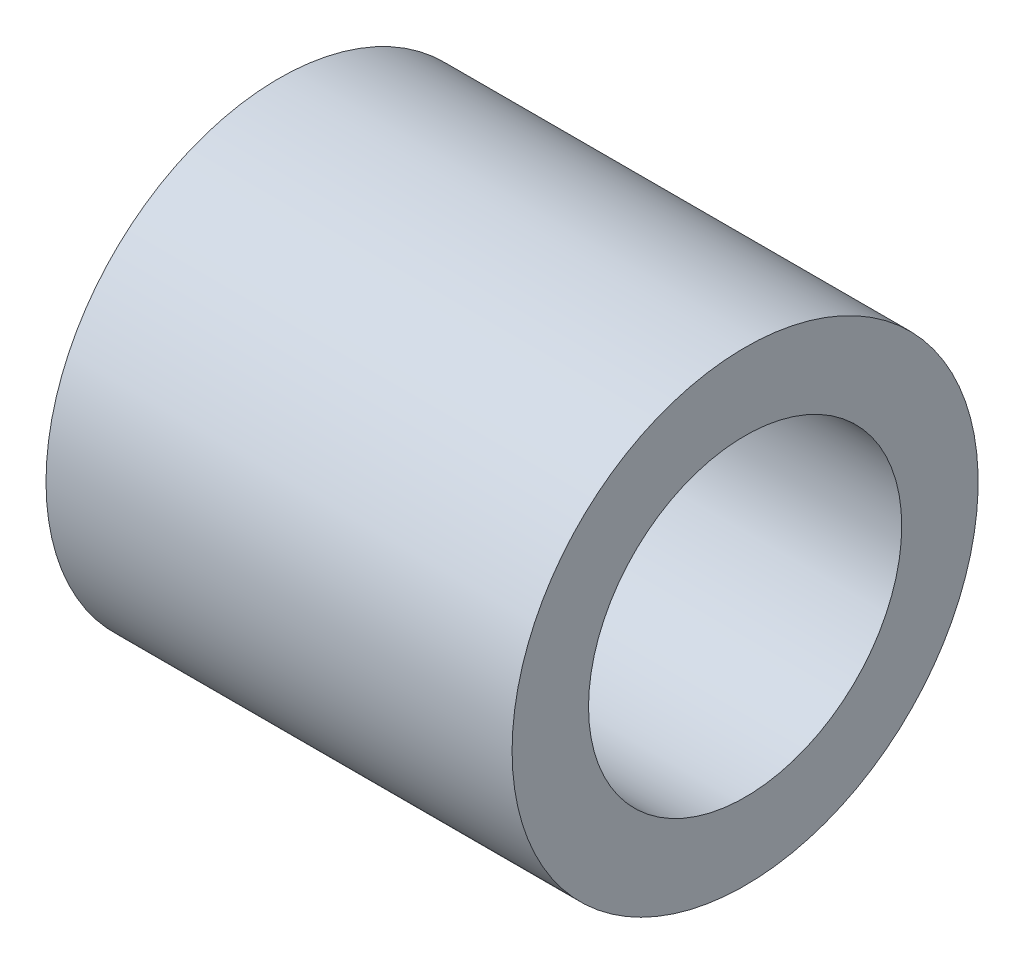
ISO-10303-21;
HEADER;
FILE_DESCRIPTION(('STEP AP214'),'2;1');
FILE_NAME('part.step','',(''),(''),'','','');
FILE_SCHEMA(('AUTOMOTIVE_DESIGN { 1 0 10303 214 1 1 1 1 }'));
ENDSEC;
DATA;
#1=APPLICATION_CONTEXT('core data for automotive mechanical design processes');
#2=APPLICATION_PROTOCOL_DEFINITION('international standard','automotive_design',2000,#1);
#3=PRODUCT_CONTEXT('',#1,'mechanical');
#4=PRODUCT('Part','Part','',(#3));
#5=PRODUCT_RELATED_PRODUCT_CATEGORY('part','',(#4));
#6=PRODUCT_DEFINITION_FORMATION('','',#4);
#7=PRODUCT_DEFINITION_CONTEXT('part definition',#1,'design');
#8=PRODUCT_DEFINITION('design','',#6,#7);
#9=PRODUCT_DEFINITION_SHAPE('','',#8);
#10=(LENGTH_UNIT() NAMED_UNIT(*) SI_UNIT(.MILLI.,.METRE.));
#11=(NAMED_UNIT(*) PLANE_ANGLE_UNIT() SI_UNIT($,.RADIAN.));
#12=(NAMED_UNIT(*) SI_UNIT($,.STERADIAN.) SOLID_ANGLE_UNIT());
#13=UNCERTAINTY_MEASURE_WITH_UNIT(LENGTH_MEASURE(1.E-05),#10,'distance_accuracy_value','');
#14=(GEOMETRIC_REPRESENTATION_CONTEXT(3) GLOBAL_UNCERTAINTY_ASSIGNED_CONTEXT((#13)) GLOBAL_UNIT_ASSIGNED_CONTEXT((#10,
#11,#12)) REPRESENTATION_CONTEXT('',''));
#15=CARTESIAN_POINT('',(0.,0.,0.));
#16=DIRECTION('',(0.,0.,1.));
#17=DIRECTION('',(1.,0.,0.));
#18=AXIS2_PLACEMENT_3D('',#15,#16,#17);
#19=CARTESIAN_POINT('',(9.525,0.,0.));
#20=DIRECTION('',(-1.,0.,0.));
#21=DIRECTION('',(0.,0.,1.));
#22=AXIS2_PLACEMENT_3D('',#19,#20,#21);
#23=CYLINDRICAL_SURFACE('',#22,4.7625);
#24=CARTESIAN_POINT('',(9.525,0.,0.));
#25=DIRECTION('',(1.,0.,0.));
#26=DIRECTION('',(0.,0.,-1.));
#27=AXIS2_PLACEMENT_3D('',#24,#25,#26);
#28=CIRCLE('',#27,4.7625);
#29=CARTESIAN_POINT('',(9.525,0.,4.7625));
#30=VERTEX_POINT('',#29);
#31=EDGE_CURVE('E10',#30,#30,#28,.T.);
#32=CARTESIAN_POINT('',(0.,0.,0.));
#33=DIRECTION('',(1.,0.,0.));
#34=DIRECTION('',(0.,0.,-1.));
#35=AXIS2_PLACEMENT_3D('',#32,#33,#34);
#36=CIRCLE('',#35,4.7625);
#37=CARTESIAN_POINT('',(0.,0.,4.7625));
#38=VERTEX_POINT('',#37);
#39=EDGE_CURVE('E34',#38,#38,#36,.T.);
#40=CARTESIAN_POINT('',(9.525,0.,4.7625));
#41=CARTESIAN_POINT('',(9.42578125,0.,4.7625));
#42=CARTESIAN_POINT('',(9.3265625,0.,4.7625));
#43=CARTESIAN_POINT('',(9.128125,0.,4.7625));
#44=CARTESIAN_POINT('',(9.02890625,0.,4.7625));
#45=CARTESIAN_POINT('',(8.83046875,0.,4.7625));
#46=CARTESIAN_POINT('',(8.73125,0.,4.7625));
#47=CARTESIAN_POINT('',(8.5328125,0.,4.7625));
#48=CARTESIAN_POINT('',(8.43359375,0.,4.7625));
#49=CARTESIAN_POINT('',(8.23515625,0.,4.7625));
#50=CARTESIAN_POINT('',(8.1359375,0.,4.7625));
#51=CARTESIAN_POINT('',(7.9375,0.,4.7625));
#52=CARTESIAN_POINT('',(7.83828125,0.,4.7625));
#53=CARTESIAN_POINT('',(7.63984375,0.,4.7625));
#54=CARTESIAN_POINT('',(7.540625,0.,4.7625));
#55=CARTESIAN_POINT('',(7.3421875,0.,4.7625));
#56=CARTESIAN_POINT('',(7.24296875,0.,4.7625));
#57=CARTESIAN_POINT('',(7.04453125,0.,4.7625));
#58=CARTESIAN_POINT('',(6.9453125,0.,4.7625));
#59=CARTESIAN_POINT('',(6.746875,0.,4.7625));
#60=CARTESIAN_POINT('',(6.64765625,0.,4.7625));
#61=CARTESIAN_POINT('',(6.44921875,0.,4.7625));
#62=CARTESIAN_POINT('',(6.35,0.,4.7625));
#63=CARTESIAN_POINT('',(6.1515625,0.,4.7625));
#64=CARTESIAN_POINT('',(6.05234375,0.,4.7625));
#65=CARTESIAN_POINT('',(5.85390625,0.,4.7625));
#66=CARTESIAN_POINT('',(5.7546875,0.,4.7625));
#67=CARTESIAN_POINT('',(5.55625,0.,4.7625));
#68=CARTESIAN_POINT('',(5.45703125,0.,4.7625));
#69=CARTESIAN_POINT('',(5.25859375,0.,4.7625));
#70=CARTESIAN_POINT('',(5.159375,0.,4.7625));
#71=CARTESIAN_POINT('',(4.9609375,0.,4.7625));
#72=CARTESIAN_POINT('',(4.86171875,0.,4.7625));
#73=CARTESIAN_POINT('',(4.66328125,0.,4.7625));
#74=CARTESIAN_POINT('',(4.5640625,0.,4.7625));
#75=CARTESIAN_POINT('',(4.365625,0.,4.7625));
#76=CARTESIAN_POINT('',(4.26640625,0.,4.7625));
#77=CARTESIAN_POINT('',(4.06796875,0.,4.7625));
#78=CARTESIAN_POINT('',(3.96875,0.,4.7625));
#79=CARTESIAN_POINT('',(3.7703125,0.,4.7625));
#80=CARTESIAN_POINT('',(3.67109375,0.,4.7625));
#81=CARTESIAN_POINT('',(3.47265625,0.,4.7625));
#82=CARTESIAN_POINT('',(3.3734375,0.,4.7625));
#83=CARTESIAN_POINT('',(3.175,0.,4.7625));
#84=CARTESIAN_POINT('',(3.07578125,0.,4.7625));
#85=CARTESIAN_POINT('',(2.87734375,0.,4.7625));
#86=CARTESIAN_POINT('',(2.778125,0.,4.7625));
#87=CARTESIAN_POINT('',(2.5796875,0.,4.7625));
#88=CARTESIAN_POINT('',(2.48046875,0.,4.7625));
#89=CARTESIAN_POINT('',(2.28203125,0.,4.7625));
#90=CARTESIAN_POINT('',(2.1828125,0.,4.7625));
#91=CARTESIAN_POINT('',(1.984375,0.,4.7625));
#92=CARTESIAN_POINT('',(1.88515625,0.,4.7625));
#93=CARTESIAN_POINT('',(1.68671875,0.,4.7625));
#94=CARTESIAN_POINT('',(1.5875,0.,4.7625));
#95=CARTESIAN_POINT('',(1.3890625,0.,4.7625));
#96=CARTESIAN_POINT('',(1.28984375,0.,4.7625));
#97=CARTESIAN_POINT('',(1.09140625,0.,4.7625));
#98=CARTESIAN_POINT('',(0.992187500000001,0.,4.7625));
#99=CARTESIAN_POINT('',(0.793750000000001,0.,4.7625));
#100=CARTESIAN_POINT('',(0.69453125,0.,4.7625));
#101=CARTESIAN_POINT('',(0.49609375,0.,4.7625));
#102=CARTESIAN_POINT('',(0.396875,0.,4.7625));
#103=CARTESIAN_POINT('',(0.1984375,0.,4.7625));
#104=CARTESIAN_POINT('',(0.0992187500000001,0.,4.7625));
#105=CARTESIAN_POINT('',(0.,0.,4.7625));
#106=B_SPLINE_CURVE_WITH_KNOTS('',3,(#40,#41,#42,#43,#44,#45,#46,#47,#48,#49,#50,#51,#52,#53,
#54,#55,#56,#57,#58,#59,#60,#61,#62,#63,#64,#65,#66,#67,#68,#69,#70,#71,#72,#73,#74,#75,#76,#77,
#78,#79,#80,#81,#82,#83,#84,#85,#86,#87,#88,#89,#90,#91,#92,#93,#94,#95,#96,#97,#98,#99,#100,
#101,#102,#103,#104,#105),.UNSPECIFIED.,.F.,.F.,(4,2,2,2,2,2,2,2,2,2,2,2,2,2,2,2,2,2,2,2,2,2,2,
2,2,2,2,2,2,2,2,2,4),(0.,0.29765625,0.5953125,0.892968750000001,1.190625,1.48828125,1.7859375,
2.08359375,2.38125,2.67890625,2.9765625,3.27421875,3.571875,3.86953125,4.1671875,4.46484375,
4.7625,5.06015625,5.3578125,5.65546875,5.953125,6.25078125,6.5484375,6.84609375,7.14375,
7.44140625,7.7390625,8.03671875,8.334375,8.63203125,8.9296875,9.22734375,9.525),.UNSPECIFIED.);
#107=EDGE_CURVE('BSEAM31',#30,#38,#106,.T.);
#108=ORIENTED_EDGE('',*,*,#31,.F.);
#109=ORIENTED_EDGE('',*,*,#39,.T.);
#110=ORIENTED_EDGE('',*,*,#107,.T.);
#111=ORIENTED_EDGE('',*,*,#107,.F.);
#112=EDGE_LOOP('',(#108,#110,#109,#111));
#113=FACE_BOUND('',#112,.T.);
#114=ADVANCED_FACE('F31',(#113),#23,.T.);
#115=CARTESIAN_POINT('',(9.525,0.,0.));
#116=DIRECTION('',(1.,0.,0.));
#117=DIRECTION('',(0.,0.,-1.));
#118=AXIS2_PLACEMENT_3D('',#115,#116,#117);
#119=PLANE('',#118);
#120=CARTESIAN_POINT('',(9.525,0.,0.));
#121=DIRECTION('',(-1.,0.,0.));
#122=DIRECTION('',(0.,0.,1.));
#123=AXIS2_PLACEMENT_3D('',#120,#121,#122);
#124=CIRCLE('',#123,3.2004);
#125=CARTESIAN_POINT('',(9.525,0.,3.2004));
#126=VERTEX_POINT('',#125);
#127=EDGE_CURVE('E41',#126,#126,#124,.T.);
#128=ORIENTED_EDGE('',*,*,#127,.T.);
#129=EDGE_LOOP('',(#128));
#130=FACE_BOUND('',#129,.T.);
#131=ORIENTED_EDGE('',*,*,#31,.T.);
#132=EDGE_LOOP('',(#131));
#133=FACE_BOUND('',#132,.T.);
#134=ADVANCED_FACE('F49',(#130,#133),#119,.T.);
#135=CARTESIAN_POINT('',(0.,0.,0.));
#136=DIRECTION('',(1.,0.,0.));
#137=DIRECTION('',(0.,0.,-1.));
#138=AXIS2_PLACEMENT_3D('',#135,#136,#137);
#139=PLANE('',#138);
#140=CARTESIAN_POINT('',(0.,0.,0.));
#141=DIRECTION('',(-1.,0.,0.));
#142=DIRECTION('',(0.,0.,1.));
#143=AXIS2_PLACEMENT_3D('',#140,#141,#142);
#144=CIRCLE('',#143,3.2004);
#145=CARTESIAN_POINT('',(0.,0.,3.2004));
#146=VERTEX_POINT('',#145);
#147=EDGE_CURVE('E43',#146,#146,#144,.T.);
#148=ORIENTED_EDGE('',*,*,#147,.F.);
#149=EDGE_LOOP('',(#148));
#150=FACE_BOUND('',#149,.T.);
#151=ORIENTED_EDGE('',*,*,#39,.F.);
#152=EDGE_LOOP('',(#151));
#153=FACE_BOUND('',#152,.T.);
#154=ADVANCED_FACE('F54',(#150,#153),#139,.F.);
#155=CARTESIAN_POINT('',(9.525,0.,0.));
#156=DIRECTION('',(-1.,0.,0.));
#157=DIRECTION('',(0.,0.,1.));
#158=AXIS2_PLACEMENT_3D('',#155,#156,#157);
#159=CYLINDRICAL_SURFACE('',#158,3.2004);
#160=CARTESIAN_POINT('',(9.525,0.,3.2004));
#161=CARTESIAN_POINT('',(9.42578125,0.,3.2004));
#162=CARTESIAN_POINT('',(9.3265625,0.,3.2004));
#163=CARTESIAN_POINT('',(9.128125,0.,3.2004));
#164=CARTESIAN_POINT('',(9.02890625,0.,3.2004));
#165=CARTESIAN_POINT('',(8.83046875,0.,3.2004));
#166=CARTESIAN_POINT('',(8.73125,0.,3.2004));
#167=CARTESIAN_POINT('',(8.5328125,0.,3.2004));
#168=CARTESIAN_POINT('',(8.43359375,0.,3.2004));
#169=CARTESIAN_POINT('',(8.23515625,0.,3.2004));
#170=CARTESIAN_POINT('',(8.1359375,0.,3.2004));
#171=CARTESIAN_POINT('',(7.9375,0.,3.2004));
#172=CARTESIAN_POINT('',(7.83828125,0.,3.2004));
#173=CARTESIAN_POINT('',(7.63984375,0.,3.2004));
#174=CARTESIAN_POINT('',(7.540625,0.,3.2004));
#175=CARTESIAN_POINT('',(7.3421875,0.,3.2004));
#176=CARTESIAN_POINT('',(7.24296875,0.,3.2004));
#177=CARTESIAN_POINT('',(7.04453125,0.,3.2004));
#178=CARTESIAN_POINT('',(6.9453125,0.,3.2004));
#179=CARTESIAN_POINT('',(6.746875,0.,3.2004));
#180=CARTESIAN_POINT('',(6.64765625,0.,3.2004));
#181=CARTESIAN_POINT('',(6.44921875,0.,3.2004));
#182=CARTESIAN_POINT('',(6.35,0.,3.2004));
#183=CARTESIAN_POINT('',(6.1515625,0.,3.2004));
#184=CARTESIAN_POINT('',(6.05234375,0.,3.2004));
#185=CARTESIAN_POINT('',(5.85390625,0.,3.2004));
#186=CARTESIAN_POINT('',(5.7546875,0.,3.2004));
#187=CARTESIAN_POINT('',(5.55625,0.,3.2004));
#188=CARTESIAN_POINT('',(5.45703125,0.,3.2004));
#189=CARTESIAN_POINT('',(5.25859375,0.,3.2004));
#190=CARTESIAN_POINT('',(5.159375,0.,3.2004));
#191=CARTESIAN_POINT('',(4.9609375,0.,3.2004));
#192=CARTESIAN_POINT('',(4.86171875,0.,3.2004));
#193=CARTESIAN_POINT('',(4.66328125,0.,3.2004));
#194=CARTESIAN_POINT('',(4.5640625,0.,3.2004));
#195=CARTESIAN_POINT('',(4.365625,0.,3.2004));
#196=CARTESIAN_POINT('',(4.26640625,0.,3.2004));
#197=CARTESIAN_POINT('',(4.06796875,0.,3.2004));
#198=CARTESIAN_POINT('',(3.96875,0.,3.2004));
#199=CARTESIAN_POINT('',(3.7703125,0.,3.2004));
#200=CARTESIAN_POINT('',(3.67109375,0.,3.2004));
#201=CARTESIAN_POINT('',(3.47265625,0.,3.2004));
#202=CARTESIAN_POINT('',(3.3734375,0.,3.2004));
#203=CARTESIAN_POINT('',(3.175,0.,3.2004));
#204=CARTESIAN_POINT('',(3.07578125,0.,3.2004));
#205=CARTESIAN_POINT('',(2.87734375,0.,3.2004));
#206=CARTESIAN_POINT('',(2.778125,0.,3.2004));
#207=CARTESIAN_POINT('',(2.5796875,0.,3.2004));
#208=CARTESIAN_POINT('',(2.48046875,0.,3.2004));
#209=CARTESIAN_POINT('',(2.28203125,0.,3.2004));
#210=CARTESIAN_POINT('',(2.1828125,0.,3.2004));
#211=CARTESIAN_POINT('',(1.984375,0.,3.2004));
#212=CARTESIAN_POINT('',(1.88515625,0.,3.2004));
#213=CARTESIAN_POINT('',(1.68671875,0.,3.2004));
#214=CARTESIAN_POINT('',(1.5875,0.,3.2004));
#215=CARTESIAN_POINT('',(1.3890625,0.,3.2004));
#216=CARTESIAN_POINT('',(1.28984375,0.,3.2004));
#217=CARTESIAN_POINT('',(1.09140625,0.,3.2004));
#218=CARTESIAN_POINT('',(0.992187500000001,0.,3.2004));
#219=CARTESIAN_POINT('',(0.793750000000001,0.,3.2004));
#220=CARTESIAN_POINT('',(0.69453125,0.,3.2004));
#221=CARTESIAN_POINT('',(0.49609375,0.,3.2004));
#222=CARTESIAN_POINT('',(0.396875,0.,3.2004));
#223=CARTESIAN_POINT('',(0.1984375,0.,3.2004));
#224=CARTESIAN_POINT('',(0.0992187500000001,0.,3.2004));
#225=CARTESIAN_POINT('',(0.,0.,3.2004));
#226=B_SPLINE_CURVE_WITH_KNOTS('',3,(#160,#161,#162,#163,#164,#165,#166,#167,#168,#169,#170,
#171,#172,#173,#174,#175,#176,#177,#178,#179,#180,#181,#182,#183,#184,#185,#186,#187,#188,#189,
#190,#191,#192,#193,#194,#195,#196,#197,#198,#199,#200,#201,#202,#203,#204,#205,#206,#207,#208,
#209,#210,#211,#212,#213,#214,#215,#216,#217,#218,#219,#220,#221,#222,#223,#224,#225),
.UNSPECIFIED.,.F.,.F.,(4,2,2,2,2,2,2,2,2,2,2,2,2,2,2,2,2,2,2,2,2,2,2,2,2,2,2,2,2,2,2,2,4),(0.,
0.297656249999998,0.595312499999999,0.892968749999999,1.190625,1.48828125,1.7859375,2.08359375,
2.38125,2.67890625,2.9765625,3.27421875,3.571875,3.86953125,4.1671875,4.46484375,4.7625,
5.06015625,5.3578125,5.65546875,5.953125,6.25078125,6.5484375,6.84609375,7.14375,7.44140625,
7.7390625,8.03671875,8.334375,8.63203125,8.9296875,9.22734375,9.525),.UNSPECIFIED.);
#227=EDGE_CURVE('BSEAM51',#126,#146,#226,.T.);
#228=ORIENTED_EDGE('',*,*,#127,.F.);
#229=ORIENTED_EDGE('',*,*,#147,.T.);
#230=ORIENTED_EDGE('',*,*,#227,.T.);
#231=ORIENTED_EDGE('',*,*,#227,.F.);
#232=EDGE_LOOP('',(#228,#230,#229,#231));
#233=FACE_BOUND('',#232,.T.);
#234=ADVANCED_FACE('F51',(#233),#159,.F.);
#235=CLOSED_SHELL('',(#114,#134,#154,#234));
#236=MANIFOLD_SOLID_BREP('B2',#235);
#237=ADVANCED_BREP_SHAPE_REPRESENTATION('',(#18,#236),#14);
#238=SHAPE_DEFINITION_REPRESENTATION(#9,#237);
ENDSEC;
END-ISO-10303-21;
